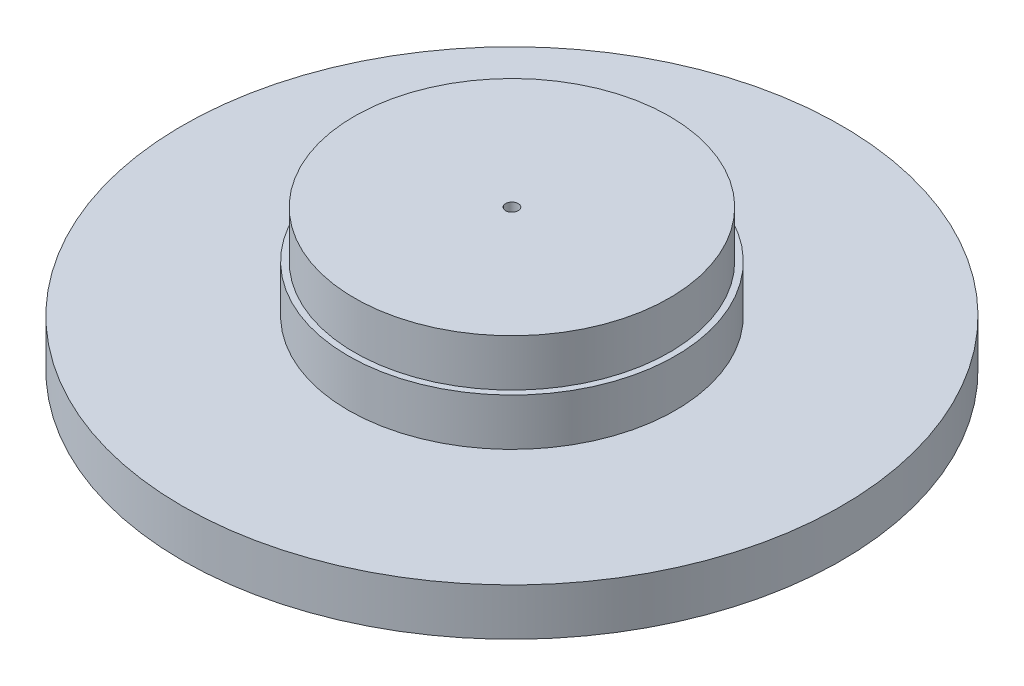
ISO-10303-21;
HEADER;
FILE_DESCRIPTION(('STEP AP214'),'2;1');
FILE_NAME('part.step','',(''),(''),'','','');
FILE_SCHEMA(('AUTOMOTIVE_DESIGN { 1 0 10303 214 1 1 1 1 }'));
ENDSEC;
DATA;
#1=APPLICATION_CONTEXT('core data for automotive mechanical design processes');
#2=APPLICATION_PROTOCOL_DEFINITION('international standard','automotive_design',2000,#1);
#3=PRODUCT_CONTEXT('',#1,'mechanical');
#4=PRODUCT('Part','Part','',(#3));
#5=PRODUCT_RELATED_PRODUCT_CATEGORY('part','',(#4));
#6=PRODUCT_DEFINITION_FORMATION('','',#4);
#7=PRODUCT_DEFINITION_CONTEXT('part definition',#1,'design');
#8=PRODUCT_DEFINITION('design','',#6,#7);
#9=PRODUCT_DEFINITION_SHAPE('','',#8);
#10=(LENGTH_UNIT() NAMED_UNIT(*) SI_UNIT(.MILLI.,.METRE.));
#11=(NAMED_UNIT(*) PLANE_ANGLE_UNIT() SI_UNIT($,.RADIAN.));
#12=(NAMED_UNIT(*) SI_UNIT($,.STERADIAN.) SOLID_ANGLE_UNIT());
#13=UNCERTAINTY_MEASURE_WITH_UNIT(LENGTH_MEASURE(1.E-05),#10,'distance_accuracy_value','');
#14=(GEOMETRIC_REPRESENTATION_CONTEXT(3) GLOBAL_UNCERTAINTY_ASSIGNED_CONTEXT((#13)) GLOBAL_UNIT_ASSIGNED_CONTEXT((#10,
#11,#12)) REPRESENTATION_CONTEXT('',''));
#15=CARTESIAN_POINT('',(0.,0.,0.));
#16=DIRECTION('',(0.,0.,1.));
#17=DIRECTION('',(1.,0.,0.));
#18=AXIS2_PLACEMENT_3D('',#15,#16,#17);
#19=CARTESIAN_POINT('',(0.,76.2,0.));
#20=DIRECTION('',(0.,-1.,0.));
#21=DIRECTION('',(0.,0.,-1.));
#22=AXIS2_PLACEMENT_3D('',#19,#20,#21);
#23=CYLINDRICAL_SURFACE('',#22,84.9884);
#24=CARTESIAN_POINT('',(0.,50.8,0.));
#25=DIRECTION('',(0.,1.,0.));
#26=DIRECTION('',(0.,0.,1.));
#27=AXIS2_PLACEMENT_3D('',#24,#25,#26);
#28=CIRCLE('',#27,84.9884);
#29=CARTESIAN_POINT('',(0.,50.8,-84.9884));
#30=VERTEX_POINT('',#29);
#31=EDGE_CURVE('E53',#30,#30,#28,.T.);
#32=CARTESIAN_POINT('',(0.,76.2,0.));
#33=DIRECTION('',(0.,1.,0.));
#34=DIRECTION('',(0.,0.,1.));
#35=AXIS2_PLACEMENT_3D('',#32,#33,#34);
#36=CIRCLE('',#35,84.9884);
#37=CARTESIAN_POINT('',(0.,76.2,-84.9884));
#38=VERTEX_POINT('',#37);
#39=EDGE_CURVE('E10',#38,#38,#36,.T.);
#40=CARTESIAN_POINT('',(0.,50.8,-84.9884));
#41=CARTESIAN_POINT('',(0.,51.0645833333333,-84.9884));
#42=CARTESIAN_POINT('',(0.,51.3291666666667,-84.9884));
#43=CARTESIAN_POINT('',(0.,51.8583333333333,-84.9884));
#44=CARTESIAN_POINT('',(0.,52.1229166666667,-84.9884));
#45=CARTESIAN_POINT('',(0.,52.6520833333333,-84.9884));
#46=CARTESIAN_POINT('',(0.,52.9166666666667,-84.9884));
#47=CARTESIAN_POINT('',(0.,53.4458333333333,-84.9884));
#48=CARTESIAN_POINT('',(0.,53.7104166666667,-84.9884));
#49=CARTESIAN_POINT('',(0.,54.2395833333333,-84.9884));
#50=CARTESIAN_POINT('',(0.,54.5041666666667,-84.9884));
#51=CARTESIAN_POINT('',(0.,55.0333333333333,-84.9884));
#52=CARTESIAN_POINT('',(0.,55.2979166666667,-84.9884));
#53=CARTESIAN_POINT('',(0.,55.8270833333333,-84.9884));
#54=CARTESIAN_POINT('',(0.,56.0916666666667,-84.9884));
#55=CARTESIAN_POINT('',(0.,56.6208333333333,-84.9884));
#56=CARTESIAN_POINT('',(0.,56.8854166666667,-84.9884));
#57=CARTESIAN_POINT('',(0.,57.4145833333333,-84.9884));
#58=CARTESIAN_POINT('',(0.,57.6791666666667,-84.9884));
#59=CARTESIAN_POINT('',(0.,58.2083333333333,-84.9884));
#60=CARTESIAN_POINT('',(0.,58.4729166666667,-84.9884));
#61=CARTESIAN_POINT('',(0.,59.0020833333333,-84.9884));
#62=CARTESIAN_POINT('',(0.,59.2666666666667,-84.9884));
#63=CARTESIAN_POINT('',(0.,59.7958333333333,-84.9884));
#64=CARTESIAN_POINT('',(0.,60.0604166666667,-84.9884));
#65=CARTESIAN_POINT('',(0.,60.5895833333333,-84.9884));
#66=CARTESIAN_POINT('',(0.,60.8541666666667,-84.9884));
#67=CARTESIAN_POINT('',(0.,61.3833333333333,-84.9884));
#68=CARTESIAN_POINT('',(0.,61.6479166666667,-84.9884));
#69=CARTESIAN_POINT('',(0.,62.1770833333333,-84.9884));
#70=CARTESIAN_POINT('',(0.,62.4416666666667,-84.9884));
#71=CARTESIAN_POINT('',(0.,62.9708333333333,-84.9884));
#72=CARTESIAN_POINT('',(0.,63.2354166666667,-84.9884));
#73=CARTESIAN_POINT('',(0.,63.7645833333333,-84.9884));
#74=CARTESIAN_POINT('',(0.,64.0291666666667,-84.9884));
#75=CARTESIAN_POINT('',(0.,64.5583333333333,-84.9884));
#76=CARTESIAN_POINT('',(0.,64.8229166666667,-84.9884));
#77=CARTESIAN_POINT('',(0.,65.3520833333333,-84.9884));
#78=CARTESIAN_POINT('',(0.,65.6166666666667,-84.9884));
#79=CARTESIAN_POINT('',(0.,66.1458333333333,-84.9884));
#80=CARTESIAN_POINT('',(0.,66.4104166666667,-84.9884));
#81=CARTESIAN_POINT('',(0.,66.9395833333333,-84.9884));
#82=CARTESIAN_POINT('',(0.,67.2041666666667,-84.9884));
#83=CARTESIAN_POINT('',(0.,67.7333333333333,-84.9884));
#84=CARTESIAN_POINT('',(0.,67.9979166666667,-84.9884));
#85=CARTESIAN_POINT('',(0.,68.5270833333333,-84.9884));
#86=CARTESIAN_POINT('',(0.,68.7916666666667,-84.9884));
#87=CARTESIAN_POINT('',(0.,69.3208333333333,-84.9884));
#88=CARTESIAN_POINT('',(0.,69.5854166666667,-84.9884));
#89=CARTESIAN_POINT('',(0.,70.1145833333333,-84.9884));
#90=CARTESIAN_POINT('',(0.,70.3791666666667,-84.9884));
#91=CARTESIAN_POINT('',(0.,70.9083333333333,-84.9884));
#92=CARTESIAN_POINT('',(0.,71.1729166666667,-84.9884));
#93=CARTESIAN_POINT('',(0.,71.7020833333333,-84.9884));
#94=CARTESIAN_POINT('',(0.,71.9666666666667,-84.9884));
#95=CARTESIAN_POINT('',(0.,72.4958333333333,-84.9884));
#96=CARTESIAN_POINT('',(0.,72.7604166666667,-84.9884));
#97=CARTESIAN_POINT('',(0.,73.2895833333333,-84.9884));
#98=CARTESIAN_POINT('',(0.,73.5541666666667,-84.9884));
#99=CARTESIAN_POINT('',(0.,74.0833333333333,-84.9884));
#100=CARTESIAN_POINT('',(0.,74.3479166666667,-84.9884));
#101=CARTESIAN_POINT('',(0.,74.8770833333333,-84.9884));
#102=CARTESIAN_POINT('',(0.,75.1416666666667,-84.9884));
#103=CARTESIAN_POINT('',(0.,75.6708333333333,-84.9884));
#104=CARTESIAN_POINT('',(0.,75.9354166666667,-84.9884));
#105=CARTESIAN_POINT('',(0.,76.2,-84.9884));
#106=B_SPLINE_CURVE_WITH_KNOTS('',3,(#40,#41,#42,#43,#44,#45,#46,#47,#48,#49,#50,#51,#52,#53,
#54,#55,#56,#57,#58,#59,#60,#61,#62,#63,#64,#65,#66,#67,#68,#69,#70,#71,#72,#73,#74,#75,#76,#77,
#78,#79,#80,#81,#82,#83,#84,#85,#86,#87,#88,#89,#90,#91,#92,#93,#94,#95,#96,#97,#98,#99,#100,
#101,#102,#103,#104,#105),.UNSPECIFIED.,.F.,.F.,(4,2,2,2,2,2,2,2,2,2,2,2,2,2,2,2,2,2,2,2,2,2,2,
2,2,2,2,2,2,2,2,2,4),(0.,0.793749999999996,1.58749999999999,2.38125,3.175,3.96874999999999,
4.7625,5.55625,6.34999999999999,7.14375,7.9375,8.73125,9.525,10.31875,11.1125,11.90625,12.7,
13.49375,14.2875,15.08125,15.875,16.66875,17.4625,18.25625,19.05,19.84375,20.6375,21.43125,
22.225,23.01875,23.8125,24.60625,25.4),.UNSPECIFIED.);
#107=EDGE_CURVE('BSEAM41',#30,#38,#106,.T.);
#108=ORIENTED_EDGE('',*,*,#31,.T.);
#109=ORIENTED_EDGE('',*,*,#39,.F.);
#110=ORIENTED_EDGE('',*,*,#107,.T.);
#111=ORIENTED_EDGE('',*,*,#107,.F.);
#112=EDGE_LOOP('',(#108,#110,#109,#111));
#113=FACE_BOUND('',#112,.T.);
#114=ADVANCED_FACE('F41',(#113),#23,.T.);
#115=CARTESIAN_POINT('',(0.,76.2,0.));
#116=DIRECTION('',(0.,1.,0.));
#117=DIRECTION('',(0.,0.,1.));
#118=AXIS2_PLACEMENT_3D('',#115,#116,#117);
#119=PLANE('',#118);
#120=CARTESIAN_POINT('',(0.,76.2,0.));
#121=DIRECTION('',(0.,-1.,0.));
#122=DIRECTION('',(0.,0.,-1.));
#123=AXIS2_PLACEMENT_3D('',#120,#121,#122);
#124=CIRCLE('',#123,3.37819999999998);
#125=CARTESIAN_POINT('',(0.,76.2,-3.37819999999998));
#126=VERTEX_POINT('',#125);
#127=EDGE_CURVE('E66',#126,#126,#124,.T.);
#128=ORIENTED_EDGE('',*,*,#127,.T.);
#129=EDGE_LOOP('',(#128));
#130=FACE_BOUND('',#129,.T.);
#131=ORIENTED_EDGE('',*,*,#39,.T.);
#132=EDGE_LOOP('',(#131));
#133=FACE_BOUND('',#132,.T.);
#134=ADVANCED_FACE('F110',(#130,#133),#119,.T.);
#135=CARTESIAN_POINT('',(0.,50.8,0.));
#136=DIRECTION('',(0.,-1.,0.));
#137=DIRECTION('',(0.,0.,-1.));
#138=AXIS2_PLACEMENT_3D('',#135,#136,#137);
#139=CYLINDRICAL_SURFACE('',#138,88.265);
#140=CARTESIAN_POINT('',(0.,25.4,0.));
#141=DIRECTION('',(0.,1.,0.));
#142=DIRECTION('',(0.,0.,1.));
#143=AXIS2_PLACEMENT_3D('',#140,#141,#142);
#144=CIRCLE('',#143,88.265);
#145=CARTESIAN_POINT('',(0.,25.4,88.265));
#146=VERTEX_POINT('',#145);
#147=EDGE_CURVE('E65',#146,#146,#144,.T.);
#148=ORIENTED_EDGE('',*,*,#147,.T.);
#149=EDGE_LOOP('',(#148));
#150=FACE_BOUND('',#149,.T.);
#151=CARTESIAN_POINT('',(0.,50.8,0.));
#152=DIRECTION('',(0.,1.,0.));
#153=DIRECTION('',(0.,0.,1.));
#154=AXIS2_PLACEMENT_3D('',#151,#152,#153);
#155=CIRCLE('',#154,88.265);
#156=CARTESIAN_POINT('',(0.,50.8,88.265));
#157=VERTEX_POINT('',#156);
#158=EDGE_CURVE('E48',#157,#157,#155,.T.);
#159=ORIENTED_EDGE('',*,*,#158,.F.);
#160=EDGE_LOOP('',(#159));
#161=FACE_BOUND('',#160,.T.);
#162=ADVANCED_FACE('F105',(#150,#161),#139,.T.);
#163=CARTESIAN_POINT('',(0.,50.8,0.));
#164=DIRECTION('',(0.,1.,0.));
#165=DIRECTION('',(0.,0.,1.));
#166=AXIS2_PLACEMENT_3D('',#163,#164,#165);
#167=PLANE('',#166);
#168=ORIENTED_EDGE('',*,*,#31,.F.);
#169=EDGE_LOOP('',(#168));
#170=FACE_BOUND('',#169,.T.);
#171=ORIENTED_EDGE('',*,*,#158,.T.);
#172=EDGE_LOOP('',(#171));
#173=FACE_BOUND('',#172,.T.);
#174=ADVANCED_FACE('F96',(#170,#173),#167,.T.);
#175=CARTESIAN_POINT('',(0.,25.4,0.));
#176=DIRECTION('',(0.,-1.,0.));
#177=DIRECTION('',(0.,0.,-1.));
#178=AXIS2_PLACEMENT_3D('',#175,#176,#177);
#179=CYLINDRICAL_SURFACE('',#178,177.8);
#180=CARTESIAN_POINT('',(0.,25.4,0.));
#181=DIRECTION('',(0.,1.,0.));
#182=DIRECTION('',(0.,0.,1.));
#183=AXIS2_PLACEMENT_3D('',#180,#181,#182);
#184=CIRCLE('',#183,177.8);
#185=CARTESIAN_POINT('',(0.,25.4,177.8));
#186=VERTEX_POINT('',#185);
#187=EDGE_CURVE('E58',#186,#186,#184,.T.);
#188=ORIENTED_EDGE('',*,*,#187,.F.);
#189=EDGE_LOOP('',(#188));
#190=FACE_BOUND('',#189,.T.);
#191=CARTESIAN_POINT('',(0.,0.,0.));
#192=DIRECTION('',(0.,1.,0.));
#193=DIRECTION('',(0.,0.,1.));
#194=AXIS2_PLACEMENT_3D('',#191,#192,#193);
#195=CIRCLE('',#194,177.8);
#196=CARTESIAN_POINT('',(0.,0.,177.8));
#197=VERTEX_POINT('',#196);
#198=EDGE_CURVE('E61',#197,#197,#195,.T.);
#199=ORIENTED_EDGE('',*,*,#198,.T.);
#200=EDGE_LOOP('',(#199));
#201=FACE_BOUND('',#200,.T.);
#202=ADVANCED_FACE('F94',(#190,#201),#179,.T.);
#203=CARTESIAN_POINT('',(0.,25.4,0.));
#204=DIRECTION('',(0.,1.,0.));
#205=DIRECTION('',(0.,0.,1.));
#206=AXIS2_PLACEMENT_3D('',#203,#204,#205);
#207=PLANE('',#206);
#208=ORIENTED_EDGE('',*,*,#147,.F.);
#209=EDGE_LOOP('',(#208));
#210=FACE_BOUND('',#209,.T.);
#211=ORIENTED_EDGE('',*,*,#187,.T.);
#212=EDGE_LOOP('',(#211));
#213=FACE_BOUND('',#212,.T.);
#214=ADVANCED_FACE('F91',(#210,#213),#207,.T.);
#215=CARTESIAN_POINT('',(0.,0.,0.));
#216=DIRECTION('',(0.,1.,0.));
#217=DIRECTION('',(0.,0.,1.));
#218=AXIS2_PLACEMENT_3D('',#215,#216,#217);
#219=PLANE('',#218);
#220=CARTESIAN_POINT('',(0.,0.,0.));
#221=DIRECTION('',(0.,-1.,0.));
#222=DIRECTION('',(0.,0.,-1.));
#223=AXIS2_PLACEMENT_3D('',#220,#221,#222);
#224=CIRCLE('',#223,6.4389);
#225=CARTESIAN_POINT('',(0.,0.,-6.4389));
#226=VERTEX_POINT('',#225);
#227=EDGE_CURVE('E80',#226,#226,#224,.T.);
#228=ORIENTED_EDGE('',*,*,#227,.F.);
#229=EDGE_LOOP('',(#228));
#230=FACE_BOUND('',#229,.T.);
#231=ORIENTED_EDGE('',*,*,#198,.F.);
#232=EDGE_LOOP('',(#231));
#233=FACE_BOUND('',#232,.T.);
#234=ADVANCED_FACE('F87',(#230,#233),#219,.F.);
#235=CARTESIAN_POINT('',(0.,0.,0.));
#236=DIRECTION('',(0.,-1.,0.));
#237=DIRECTION('',(0.,0.,-1.));
#238=AXIS2_PLACEMENT_3D('',#235,#236,#237);
#239=CYLINDRICAL_SURFACE('',#238,3.37819999999999);
#240=ORIENTED_EDGE('',*,*,#127,.F.);
#241=EDGE_LOOP('',(#240));
#242=FACE_BOUND('',#241,.T.);
#243=CARTESIAN_POINT('',(0.,2.5682322411443,0.));
#244=DIRECTION('',(0.,-1.,0.));
#245=DIRECTION('',(0.,0.,-1.));
#246=AXIS2_PLACEMENT_3D('',#243,#244,#245);
#247=CIRCLE('',#246,3.37819999999999);
#248=CARTESIAN_POINT('',(0.,2.5682322411443,-3.37819999999999));
#249=VERTEX_POINT('',#248);
#250=EDGE_CURVE('E76',#249,#249,#247,.T.);
#251=ORIENTED_EDGE('',*,*,#250,.T.);
#252=EDGE_LOOP('',(#251));
#253=FACE_BOUND('',#252,.T.);
#254=ADVANCED_FACE('F90',(#242,#253),#239,.F.);
#255=CARTESIAN_POINT('',(0.,0.,0.));
#256=DIRECTION('',(0.,-1.,0.));
#257=DIRECTION('',(0.,0.,-1.));
#258=AXIS2_PLACEMENT_3D('',#255,#256,#257);
#259=CONICAL_SURFACE('',#258,6.4389,0.872664625997167);
#260=ORIENTED_EDGE('',*,*,#250,.F.);
#261=EDGE_LOOP('',(#260));
#262=FACE_BOUND('',#261,.T.);
#263=ORIENTED_EDGE('',*,*,#227,.T.);
#264=EDGE_LOOP('',(#263));
#265=FACE_BOUND('',#264,.T.);
#266=ADVANCED_FACE('F85',(#262,#265),#259,.F.);
#267=CLOSED_SHELL('',(#114,#134,#162,#174,#202,#214,#234,#254,#266));
#268=MANIFOLD_SOLID_BREP('B2',#267);
#269=ADVANCED_BREP_SHAPE_REPRESENTATION('',(#18,#268),#14);
#270=SHAPE_DEFINITION_REPRESENTATION(#9,#269);
ENDSEC;
END-ISO-10303-21;
